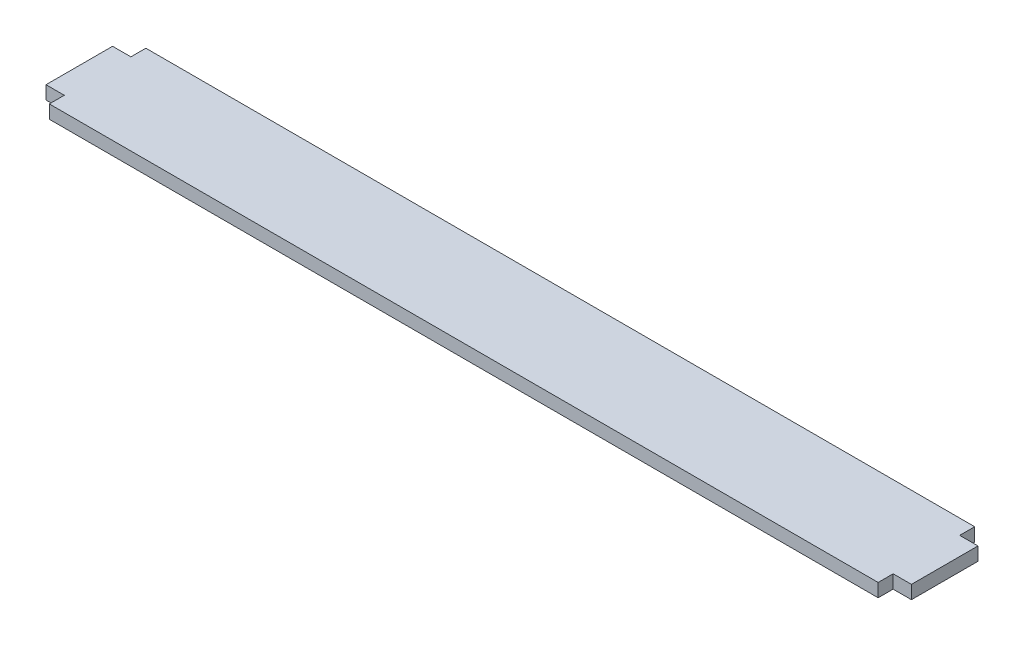
ISO-10303-21;
HEADER;
FILE_DESCRIPTION(('STEP AP214'),'2;1');
FILE_NAME('part.step','',(''),(''),'','','');
FILE_SCHEMA(('AUTOMOTIVE_DESIGN { 1 0 10303 214 1 1 1 1 }'));
ENDSEC;
DATA;
#1=APPLICATION_CONTEXT('core data for automotive mechanical design processes');
#2=APPLICATION_PROTOCOL_DEFINITION('international standard','automotive_design',2000,#1);
#3=PRODUCT_CONTEXT('',#1,'mechanical');
#4=PRODUCT('Part','Part','',(#3));
#5=PRODUCT_RELATED_PRODUCT_CATEGORY('part','',(#4));
#6=PRODUCT_DEFINITION_FORMATION('','',#4);
#7=PRODUCT_DEFINITION_CONTEXT('part definition',#1,'design');
#8=PRODUCT_DEFINITION('design','',#6,#7);
#9=PRODUCT_DEFINITION_SHAPE('','',#8);
#10=(LENGTH_UNIT() NAMED_UNIT(*) SI_UNIT(.MILLI.,.METRE.));
#11=(NAMED_UNIT(*) PLANE_ANGLE_UNIT() SI_UNIT($,.RADIAN.));
#12=(NAMED_UNIT(*) SI_UNIT($,.STERADIAN.) SOLID_ANGLE_UNIT());
#13=UNCERTAINTY_MEASURE_WITH_UNIT(LENGTH_MEASURE(1.E-05),#10,'distance_accuracy_value','');
#14=(GEOMETRIC_REPRESENTATION_CONTEXT(3) GLOBAL_UNCERTAINTY_ASSIGNED_CONTEXT((#13)) GLOBAL_UNIT_ASSIGNED_CONTEXT((#10,
#11,#12)) REPRESENTATION_CONTEXT('',''));
#15=CARTESIAN_POINT('',(0.,0.,0.));
#16=DIRECTION('',(0.,0.,1.));
#17=DIRECTION('',(1.,0.,0.));
#18=AXIS2_PLACEMENT_3D('',#15,#16,#17);
#19=CARTESIAN_POINT('',(-124.5,4.,14.4984944243489));
#20=DIRECTION('',(1.,0.,0.));
#21=DIRECTION('',(0.,0.,-1.));
#22=AXIS2_PLACEMENT_3D('',#19,#20,#21);
#23=PLANE('',#22);
#24=DIRECTION('',(0.,0.,1.));
#25=VECTOR('',#24,1.);
#26=CARTESIAN_POINT('',(-124.5,0.,14.4984944243489));
#27=LINE('',#26,#25);
#28=CARTESIAN_POINT('',(-124.5,0.,-14.4984944243489));
#29=VERTEX_POINT('',#28);
#30=CARTESIAN_POINT('',(-124.5,0.,-10.));
#31=VERTEX_POINT('',#30);
#32=EDGE_CURVE('E207',#29,#31,#27,.T.);
#33=ORIENTED_EDGE('',*,*,#32,.T.);
#34=DIRECTION('',(0.,1.,0.));
#35=VECTOR('',#34,1.);
#36=CARTESIAN_POINT('',(-124.5,4.,-10.));
#37=LINE('',#36,#35);
#38=CARTESIAN_POINT('',(-124.5,4.,-10.));
#39=VERTEX_POINT('',#38);
#40=EDGE_CURVE('E133',#31,#39,#37,.T.);
#41=ORIENTED_EDGE('',*,*,#40,.T.);
#42=DIRECTION('',(0.,0.,1.));
#43=VECTOR('',#42,1.);
#44=CARTESIAN_POINT('',(-124.5,4.,14.4984944243489));
#45=LINE('',#44,#43);
#46=CARTESIAN_POINT('',(-124.5,4.,-14.4984944243489));
#47=VERTEX_POINT('',#46);
#48=EDGE_CURVE('E177',#47,#39,#45,.T.);
#49=ORIENTED_EDGE('',*,*,#48,.F.);
#50=DIRECTION('',(0.,-1.,0.));
#51=VECTOR('',#50,1.);
#52=CARTESIAN_POINT('',(-124.5,4.,-14.4984944243489));
#53=LINE('',#52,#51);
#54=EDGE_CURVE('E44',#47,#29,#53,.T.);
#55=ORIENTED_EDGE('',*,*,#54,.T.);
#56=EDGE_LOOP('',(#33,#41,#49,#55));
#57=FACE_BOUND('',#56,.T.);
#58=ADVANCED_FACE('F35',(#57),#23,.F.);
#59=CARTESIAN_POINT('',(124.5,4.,14.4984944243489));
#60=DIRECTION('',(-1.,0.,0.));
#61=DIRECTION('',(0.,0.,1.));
#62=AXIS2_PLACEMENT_3D('',#59,#60,#61);
#63=PLANE('',#62);
#64=DIRECTION('',(0.,1.,0.));
#65=VECTOR('',#64,1.);
#66=CARTESIAN_POINT('',(124.5,4.,-10.));
#67=LINE('',#66,#65);
#68=CARTESIAN_POINT('',(124.5,0.,-10.));
#69=VERTEX_POINT('',#68);
#70=CARTESIAN_POINT('',(124.5,4.,-10.));
#71=VERTEX_POINT('',#70);
#72=EDGE_CURVE('E138',#69,#71,#67,.T.);
#73=ORIENTED_EDGE('',*,*,#72,.F.);
#74=DIRECTION('',(0.,0.,-1.));
#75=VECTOR('',#74,1.);
#76=CARTESIAN_POINT('',(124.5,0.,14.4984944243489));
#77=LINE('',#76,#75);
#78=CARTESIAN_POINT('',(124.5,0.,-14.4984944243489));
#79=VERTEX_POINT('',#78);
#80=EDGE_CURVE('E194',#69,#79,#77,.T.);
#81=ORIENTED_EDGE('',*,*,#80,.T.);
#82=DIRECTION('',(0.,-1.,0.));
#83=VECTOR('',#82,1.);
#84=CARTESIAN_POINT('',(124.5,4.,-14.4984944243489));
#85=LINE('',#84,#83);
#86=CARTESIAN_POINT('',(124.5,4.,-14.4984944243489));
#87=VERTEX_POINT('',#86);
#88=EDGE_CURVE('E11',#87,#79,#85,.T.);
#89=ORIENTED_EDGE('',*,*,#88,.F.);
#90=DIRECTION('',(0.,0.,-1.));
#91=VECTOR('',#90,1.);
#92=CARTESIAN_POINT('',(124.5,4.,14.4984944243489));
#93=LINE('',#92,#91);
#94=EDGE_CURVE('E60',#71,#87,#93,.T.);
#95=ORIENTED_EDGE('',*,*,#94,.F.);
#96=EDGE_LOOP('',(#73,#81,#89,#95));
#97=FACE_BOUND('',#96,.T.);
#98=ADVANCED_FACE('F37',(#97),#63,.F.);
#99=DIRECTION('',(0.,-1.,0.));
#100=VECTOR('',#99,1.);
#101=CARTESIAN_POINT('',(124.5,4.,9.99999999999999));
#102=LINE('',#101,#100);
#103=CARTESIAN_POINT('',(124.5,4.,9.99999999999999));
#104=VERTEX_POINT('',#103);
#105=CARTESIAN_POINT('',(124.5,0.,9.99999999999999));
#106=VERTEX_POINT('',#105);
#107=EDGE_CURVE('E223',#104,#106,#102,.T.);
#108=ORIENTED_EDGE('',*,*,#107,.F.);
#109=CARTESIAN_POINT('',(124.5,4.,14.4984944243489));
#110=VERTEX_POINT('',#109);
#111=EDGE_CURVE('E257',#110,#104,#93,.T.);
#112=ORIENTED_EDGE('',*,*,#111,.F.);
#113=DIRECTION('',(0.,-1.,0.));
#114=VECTOR('',#113,1.);
#115=CARTESIAN_POINT('',(124.5,4.,14.4984944243489));
#116=LINE('',#115,#114);
#117=CARTESIAN_POINT('',(124.5,0.,14.4984944243489));
#118=VERTEX_POINT('',#117);
#119=EDGE_CURVE('E187',#110,#118,#116,.T.);
#120=ORIENTED_EDGE('',*,*,#119,.T.);
#121=EDGE_CURVE('E197',#118,#106,#77,.T.);
#122=ORIENTED_EDGE('',*,*,#121,.T.);
#123=EDGE_LOOP('',(#108,#112,#120,#122));
#124=FACE_BOUND('',#123,.T.);
#125=ADVANCED_FACE('F281',(#124),#63,.F.);
#126=CARTESIAN_POINT('',(-124.5,4.,-14.4984944243489));
#127=DIRECTION('',(0.,0.,1.));
#128=DIRECTION('',(1.,0.,0.));
#129=AXIS2_PLACEMENT_3D('',#126,#127,#128);
#130=PLANE('',#129);
#131=DIRECTION('',(-1.,0.,0.));
#132=VECTOR('',#131,1.);
#133=CARTESIAN_POINT('',(-124.5,0.,-14.4984944243489));
#134=LINE('',#133,#132);
#135=EDGE_CURVE('E190',#79,#29,#134,.T.);
#136=ORIENTED_EDGE('',*,*,#135,.T.);
#137=ORIENTED_EDGE('',*,*,#54,.F.);
#138=DIRECTION('',(-1.,0.,0.));
#139=VECTOR('',#138,1.);
#140=CARTESIAN_POINT('',(-124.5,4.,-14.4984944243489));
#141=LINE('',#140,#139);
#142=EDGE_CURVE('E178',#87,#47,#141,.T.);
#143=ORIENTED_EDGE('',*,*,#142,.F.);
#144=ORIENTED_EDGE('',*,*,#88,.T.);
#145=EDGE_LOOP('',(#136,#137,#143,#144));
#146=FACE_BOUND('',#145,.T.);
#147=ADVANCED_FACE('F254',(#146),#130,.F.);
#148=CARTESIAN_POINT('',(-124.5,4.,9.99999999999999));
#149=VERTEX_POINT('',#148);
#150=CARTESIAN_POINT('',(-124.5,4.,14.4984944243489));
#151=VERTEX_POINT('',#150);
#152=EDGE_CURVE('E174',#149,#151,#45,.T.);
#153=ORIENTED_EDGE('',*,*,#152,.F.);
#154=DIRECTION('',(0.,-1.,0.));
#155=VECTOR('',#154,1.);
#156=CARTESIAN_POINT('',(-124.5,4.,9.99999999999999));
#157=LINE('',#156,#155);
#158=CARTESIAN_POINT('',(-124.5,0.,9.99999999999999));
#159=VERTEX_POINT('',#158);
#160=EDGE_CURVE('E146',#149,#159,#157,.T.);
#161=ORIENTED_EDGE('',*,*,#160,.T.);
#162=CARTESIAN_POINT('',(-124.5,0.,14.4984944243489));
#163=VERTEX_POINT('',#162);
#164=EDGE_CURVE('E210',#159,#163,#27,.T.);
#165=ORIENTED_EDGE('',*,*,#164,.T.);
#166=DIRECTION('',(0.,-1.,0.));
#167=VECTOR('',#166,1.);
#168=CARTESIAN_POINT('',(-124.5,4.,14.4984944243489));
#169=LINE('',#168,#167);
#170=EDGE_CURVE('E201',#151,#163,#169,.T.);
#171=ORIENTED_EDGE('',*,*,#170,.F.);
#172=EDGE_LOOP('',(#153,#161,#165,#171));
#173=FACE_BOUND('',#172,.T.);
#174=ADVANCED_FACE('F271',(#173),#23,.F.);
#175=CARTESIAN_POINT('',(-124.5,4.,14.4984944243489));
#176=DIRECTION('',(0.,0.,-1.));
#177=DIRECTION('',(-1.,0.,0.));
#178=AXIS2_PLACEMENT_3D('',#175,#176,#177);
#179=PLANE('',#178);
#180=DIRECTION('',(1.,0.,0.));
#181=VECTOR('',#180,1.);
#182=CARTESIAN_POINT('',(-124.5,0.,14.4984944243489));
#183=LINE('',#182,#181);
#184=EDGE_CURVE('E206',#163,#118,#183,.T.);
#185=ORIENTED_EDGE('',*,*,#184,.T.);
#186=ORIENTED_EDGE('',*,*,#119,.F.);
#187=DIRECTION('',(1.,0.,0.));
#188=VECTOR('',#187,1.);
#189=CARTESIAN_POINT('',(-124.5,4.,14.4984944243489));
#190=LINE('',#189,#188);
#191=EDGE_CURVE('E184',#151,#110,#190,.T.);
#192=ORIENTED_EDGE('',*,*,#191,.F.);
#193=ORIENTED_EDGE('',*,*,#170,.T.);
#194=EDGE_LOOP('',(#185,#186,#192,#193));
#195=FACE_BOUND('',#194,.T.);
#196=ADVANCED_FACE('F263',(#195),#179,.F.);
#197=CARTESIAN_POINT('',(0.,4.,0.));
#198=DIRECTION('',(0.,-1.,0.));
#199=DIRECTION('',(0.,0.,-1.));
#200=AXIS2_PLACEMENT_3D('',#197,#198,#199);
#201=PLANE('',#200);
#202=ORIENTED_EDGE('',*,*,#111,.T.);
#203=DIRECTION('',(-1.,0.,0.));
#204=VECTOR('',#203,1.);
#205=CARTESIAN_POINT('',(130.,4.,9.99999999999999));
#206=LINE('',#205,#204);
#207=CARTESIAN_POINT('',(130.,4.,9.99999999999999));
#208=VERTEX_POINT('',#207);
#209=EDGE_CURVE('E239',#208,#104,#206,.T.);
#210=ORIENTED_EDGE('',*,*,#209,.F.);
#211=DIRECTION('',(0.,0.,1.));
#212=VECTOR('',#211,1.);
#213=CARTESIAN_POINT('',(130.,4.,9.99999999999999));
#214=LINE('',#213,#212);
#215=CARTESIAN_POINT('',(130.,4.,-10.));
#216=VERTEX_POINT('',#215);
#217=EDGE_CURVE('E317',#216,#208,#214,.T.);
#218=ORIENTED_EDGE('',*,*,#217,.F.);
#219=DIRECTION('',(-1.,0.,0.));
#220=VECTOR('',#219,1.);
#221=CARTESIAN_POINT('',(130.,4.,-10.));
#222=LINE('',#221,#220);
#223=EDGE_CURVE('E244',#216,#71,#222,.T.);
#224=ORIENTED_EDGE('',*,*,#223,.T.);
#225=ORIENTED_EDGE('',*,*,#94,.T.);
#226=ORIENTED_EDGE('',*,*,#142,.T.);
#227=ORIENTED_EDGE('',*,*,#48,.T.);
#228=DIRECTION('',(1.,0.,0.));
#229=VECTOR('',#228,1.);
#230=CARTESIAN_POINT('',(-130.,4.,-10.));
#231=LINE('',#230,#229);
#232=CARTESIAN_POINT('',(-130.,4.,-10.));
#233=VERTEX_POINT('',#232);
#234=EDGE_CURVE('E156',#233,#39,#231,.T.);
#235=ORIENTED_EDGE('',*,*,#234,.F.);
#236=DIRECTION('',(0.,0.,1.));
#237=VECTOR('',#236,1.);
#238=CARTESIAN_POINT('',(-130.,4.,9.99999999999999));
#239=LINE('',#238,#237);
#240=CARTESIAN_POINT('',(-130.,4.,9.99999999999999));
#241=VERTEX_POINT('',#240);
#242=EDGE_CURVE('E145',#233,#241,#239,.T.);
#243=ORIENTED_EDGE('',*,*,#242,.T.);
#244=DIRECTION('',(1.,0.,0.));
#245=VECTOR('',#244,1.);
#246=CARTESIAN_POINT('',(-130.,4.,9.99999999999999));
#247=LINE('',#246,#245);
#248=EDGE_CURVE('E166',#241,#149,#247,.T.);
#249=ORIENTED_EDGE('',*,*,#248,.T.);
#250=ORIENTED_EDGE('',*,*,#152,.T.);
#251=ORIENTED_EDGE('',*,*,#191,.T.);
#252=EDGE_LOOP('',(#202,#210,#218,#224,#225,#226,#227,#235,#243,#249,#250,#251));
#253=FACE_BOUND('',#252,.T.);
#254=ADVANCED_FACE('F261',(#253),#201,.F.);
#255=CARTESIAN_POINT('',(0.,0.,0.));
#256=DIRECTION('',(0.,-1.,0.));
#257=DIRECTION('',(0.,0.,-1.));
#258=AXIS2_PLACEMENT_3D('',#255,#256,#257);
#259=PLANE('',#258);
#260=ORIENTED_EDGE('',*,*,#121,.F.);
#261=ORIENTED_EDGE('',*,*,#184,.F.);
#262=ORIENTED_EDGE('',*,*,#164,.F.);
#263=DIRECTION('',(1.,0.,0.));
#264=VECTOR('',#263,1.);
#265=CARTESIAN_POINT('',(-130.,0.,9.99999999999999));
#266=LINE('',#265,#264);
#267=CARTESIAN_POINT('',(-130.,0.,9.99999999999999));
#268=VERTEX_POINT('',#267);
#269=EDGE_CURVE('E52',#268,#159,#266,.T.);
#270=ORIENTED_EDGE('',*,*,#269,.F.);
#271=DIRECTION('',(0.,0.,-1.));
#272=VECTOR('',#271,1.);
#273=CARTESIAN_POINT('',(-130.,0.,9.99999999999999));
#274=LINE('',#273,#272);
#275=CARTESIAN_POINT('',(-130.,0.,-10.));
#276=VERTEX_POINT('',#275);
#277=EDGE_CURVE('E143',#268,#276,#274,.T.);
#278=ORIENTED_EDGE('',*,*,#277,.T.);
#279=DIRECTION('',(1.,0.,0.));
#280=VECTOR('',#279,1.);
#281=CARTESIAN_POINT('',(-130.,0.,-10.));
#282=LINE('',#281,#280);
#283=EDGE_CURVE('E127',#276,#31,#282,.T.);
#284=ORIENTED_EDGE('',*,*,#283,.T.);
#285=ORIENTED_EDGE('',*,*,#32,.F.);
#286=ORIENTED_EDGE('',*,*,#135,.F.);
#287=ORIENTED_EDGE('',*,*,#80,.F.);
#288=DIRECTION('',(-1.,0.,0.));
#289=VECTOR('',#288,1.);
#290=CARTESIAN_POINT('',(130.,0.,-10.));
#291=LINE('',#290,#289);
#292=CARTESIAN_POINT('',(130.,0.,-10.));
#293=VERTEX_POINT('',#292);
#294=EDGE_CURVE('E215',#293,#69,#291,.T.);
#295=ORIENTED_EDGE('',*,*,#294,.F.);
#296=DIRECTION('',(0.,0.,-1.));
#297=VECTOR('',#296,1.);
#298=CARTESIAN_POINT('',(130.,0.,9.99999999999999));
#299=LINE('',#298,#297);
#300=CARTESIAN_POINT('',(130.,0.,9.99999999999999));
#301=VERTEX_POINT('',#300);
#302=EDGE_CURVE('E219',#301,#293,#299,.T.);
#303=ORIENTED_EDGE('',*,*,#302,.F.);
#304=DIRECTION('',(-1.,0.,0.));
#305=VECTOR('',#304,1.);
#306=CARTESIAN_POINT('',(130.,0.,9.99999999999999));
#307=LINE('',#306,#305);
#308=EDGE_CURVE('E218',#301,#106,#307,.T.);
#309=ORIENTED_EDGE('',*,*,#308,.T.);
#310=EDGE_LOOP('',(#260,#261,#262,#270,#278,#284,#285,#286,#287,#295,#303,#309));
#311=FACE_BOUND('',#310,.T.);
#312=ADVANCED_FACE('F149',(#311),#259,.T.);
#313=CARTESIAN_POINT('',(130.,4.,-10.));
#314=DIRECTION('',(0.,0.,1.));
#315=DIRECTION('',(1.,0.,0.));
#316=AXIS2_PLACEMENT_3D('',#313,#314,#315);
#317=PLANE('',#316);
#318=ORIENTED_EDGE('',*,*,#72,.T.);
#319=ORIENTED_EDGE('',*,*,#223,.F.);
#320=DIRECTION('',(0.,1.,0.));
#321=VECTOR('',#320,1.);
#322=CARTESIAN_POINT('',(130.,4.,-10.));
#323=LINE('',#322,#321);
#324=EDGE_CURVE('E236',#293,#216,#323,.T.);
#325=ORIENTED_EDGE('',*,*,#324,.F.);
#326=ORIENTED_EDGE('',*,*,#294,.T.);
#327=EDGE_LOOP('',(#318,#319,#325,#326));
#328=FACE_BOUND('',#327,.T.);
#329=ADVANCED_FACE('F269',(#328),#317,.F.);
#330=CARTESIAN_POINT('',(130.,4.,9.99999999999999));
#331=DIRECTION('',(0.,0.,-1.));
#332=DIRECTION('',(-1.,0.,0.));
#333=AXIS2_PLACEMENT_3D('',#330,#331,#332);
#334=PLANE('',#333);
#335=ORIENTED_EDGE('',*,*,#107,.T.);
#336=ORIENTED_EDGE('',*,*,#308,.F.);
#337=DIRECTION('',(0.,-1.,0.));
#338=VECTOR('',#337,1.);
#339=CARTESIAN_POINT('',(130.,4.,9.99999999999999));
#340=LINE('',#339,#338);
#341=EDGE_CURVE('E316',#208,#301,#340,.T.);
#342=ORIENTED_EDGE('',*,*,#341,.F.);
#343=ORIENTED_EDGE('',*,*,#209,.T.);
#344=EDGE_LOOP('',(#335,#336,#342,#343));
#345=FACE_BOUND('',#344,.T.);
#346=ADVANCED_FACE('F304',(#345),#334,.F.);
#347=CARTESIAN_POINT('',(130.,0.,0.));
#348=DIRECTION('',(1.,0.,0.));
#349=DIRECTION('',(0.,0.,-1.));
#350=AXIS2_PLACEMENT_3D('',#347,#348,#349);
#351=PLANE('',#350);
#352=ORIENTED_EDGE('',*,*,#324,.T.);
#353=ORIENTED_EDGE('',*,*,#217,.T.);
#354=ORIENTED_EDGE('',*,*,#341,.T.);
#355=ORIENTED_EDGE('',*,*,#302,.T.);
#356=EDGE_LOOP('',(#352,#353,#354,#355));
#357=FACE_BOUND('',#356,.T.);
#358=ADVANCED_FACE('F299',(#357),#351,.T.);
#359=CARTESIAN_POINT('',(-130.,4.,-10.));
#360=DIRECTION('',(0.,0.,-1.));
#361=DIRECTION('',(-1.,0.,0.));
#362=AXIS2_PLACEMENT_3D('',#359,#360,#361);
#363=PLANE('',#362);
#364=ORIENTED_EDGE('',*,*,#40,.F.);
#365=ORIENTED_EDGE('',*,*,#283,.F.);
#366=DIRECTION('',(0.,1.,0.));
#367=VECTOR('',#366,1.);
#368=CARTESIAN_POINT('',(-130.,4.,-10.));
#369=LINE('',#368,#367);
#370=EDGE_CURVE('E130',#276,#233,#369,.T.);
#371=ORIENTED_EDGE('',*,*,#370,.T.);
#372=ORIENTED_EDGE('',*,*,#234,.T.);
#373=EDGE_LOOP('',(#364,#365,#371,#372));
#374=FACE_BOUND('',#373,.T.);
#375=ADVANCED_FACE('F129',(#374),#363,.T.);
#376=CARTESIAN_POINT('',(-130.,4.,9.99999999999999));
#377=DIRECTION('',(0.,0.,1.));
#378=DIRECTION('',(1.,0.,0.));
#379=AXIS2_PLACEMENT_3D('',#376,#377,#378);
#380=PLANE('',#379);
#381=ORIENTED_EDGE('',*,*,#160,.F.);
#382=ORIENTED_EDGE('',*,*,#248,.F.);
#383=DIRECTION('',(0.,-1.,0.));
#384=VECTOR('',#383,1.);
#385=CARTESIAN_POINT('',(-130.,4.,9.99999999999999));
#386=LINE('',#385,#384);
#387=EDGE_CURVE('E151',#241,#268,#386,.T.);
#388=ORIENTED_EDGE('',*,*,#387,.T.);
#389=ORIENTED_EDGE('',*,*,#269,.T.);
#390=EDGE_LOOP('',(#381,#382,#388,#389));
#391=FACE_BOUND('',#390,.T.);
#392=ADVANCED_FACE('F291',(#391),#380,.T.);
#393=CARTESIAN_POINT('',(-130.,0.,0.));
#394=DIRECTION('',(-1.,0.,0.));
#395=DIRECTION('',(0.,0.,-1.));
#396=AXIS2_PLACEMENT_3D('',#393,#394,#395);
#397=PLANE('',#396);
#398=ORIENTED_EDGE('',*,*,#370,.F.);
#399=ORIENTED_EDGE('',*,*,#277,.F.);
#400=ORIENTED_EDGE('',*,*,#387,.F.);
#401=ORIENTED_EDGE('',*,*,#242,.F.);
#402=EDGE_LOOP('',(#398,#399,#400,#401));
#403=FACE_BOUND('',#402,.T.);
#404=ADVANCED_FACE('F141',(#403),#397,.T.);
#405=CLOSED_SHELL('',(#58,#98,#125,#147,#174,#196,#254,#312,#329,#346,#358,#375,#392,#404));
#406=MANIFOLD_SOLID_BREP('B2',#405);
#407=ADVANCED_BREP_SHAPE_REPRESENTATION('',(#18,#406),#14);
#408=SHAPE_DEFINITION_REPRESENTATION(#9,#407);
ENDSEC;
END-ISO-10303-21;
